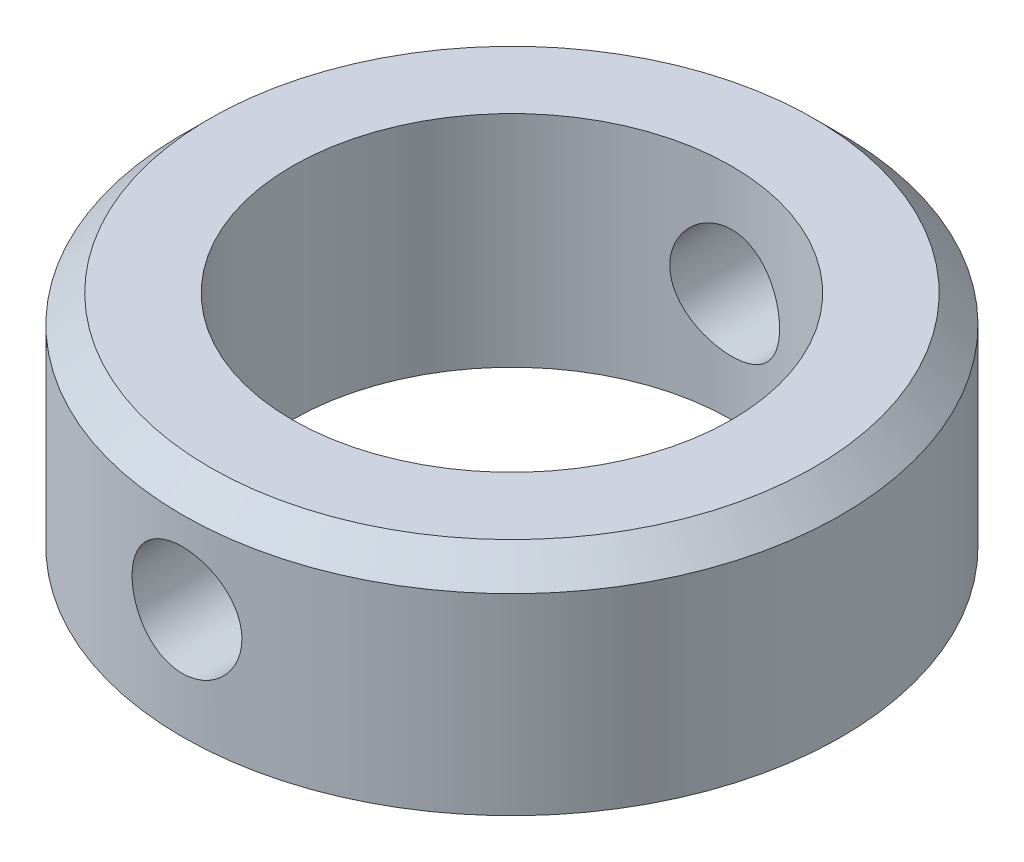
ISO-10303-21;
HEADER;
FILE_DESCRIPTION(('STEP AP214'),'2;1');
FILE_NAME('part.step','',(''),(''),'','','');
FILE_SCHEMA(('AUTOMOTIVE_DESIGN { 1 0 10303 214 1 1 1 1 }'));
ENDSEC;
DATA;
#1=APPLICATION_CONTEXT('core data for automotive mechanical design processes');
#2=APPLICATION_PROTOCOL_DEFINITION('international standard','automotive_design',2000,#1);
#3=PRODUCT_CONTEXT('',#1,'mechanical');
#4=PRODUCT('Part','Part','',(#3));
#5=PRODUCT_RELATED_PRODUCT_CATEGORY('part','',(#4));
#6=PRODUCT_DEFINITION_FORMATION('','',#4);
#7=PRODUCT_DEFINITION_CONTEXT('part definition',#1,'design');
#8=PRODUCT_DEFINITION('design','',#6,#7);
#9=PRODUCT_DEFINITION_SHAPE('','',#8);
#10=(LENGTH_UNIT() NAMED_UNIT(*) SI_UNIT(.MILLI.,.METRE.));
#11=(NAMED_UNIT(*) PLANE_ANGLE_UNIT() SI_UNIT($,.RADIAN.));
#12=(NAMED_UNIT(*) SI_UNIT($,.STERADIAN.) SOLID_ANGLE_UNIT());
#13=UNCERTAINTY_MEASURE_WITH_UNIT(LENGTH_MEASURE(1.E-05),#10,'distance_accuracy_value','');
#14=(GEOMETRIC_REPRESENTATION_CONTEXT(3) GLOBAL_UNCERTAINTY_ASSIGNED_CONTEXT((#13)) GLOBAL_UNIT_ASSIGNED_CONTEXT((#10,
#11,#12)) REPRESENTATION_CONTEXT('',''));
#15=CARTESIAN_POINT('',(0.,0.,0.));
#16=DIRECTION('',(0.,0.,1.));
#17=DIRECTION('',(1.,0.,0.));
#18=AXIS2_PLACEMENT_3D('',#15,#16,#17);
#19=CARTESIAN_POINT('',(0.,8.,0.));
#20=DIRECTION('',(0.,1.,0.));
#21=DIRECTION('',(0.,0.,1.));
#22=AXIS2_PLACEMENT_3D('',#19,#20,#21);
#23=PLANE('',#22);
#24=CARTESIAN_POINT('',(0.,8.,0.));
#25=DIRECTION('',(0.,1.,0.));
#26=DIRECTION('',(0.,0.,1.));
#27=AXIS2_PLACEMENT_3D('',#24,#25,#26);
#28=CIRCLE('',#27,11.);
#29=CARTESIAN_POINT('',(0.,8.,11.));
#30=VERTEX_POINT('',#29);
#31=EDGE_CURVE('E48',#30,#30,#28,.T.);
#32=ORIENTED_EDGE('',*,*,#31,.T.);
#33=EDGE_LOOP('',(#32));
#34=FACE_BOUND('',#33,.T.);
#35=CARTESIAN_POINT('',(0.,8.,0.));
#36=DIRECTION('',(0.,1.,0.));
#37=DIRECTION('',(0.,0.,1.));
#38=AXIS2_PLACEMENT_3D('',#35,#36,#37);
#39=CIRCLE('',#38,8.);
#40=CARTESIAN_POINT('',(0.,8.,8.));
#41=VERTEX_POINT('',#40);
#42=EDGE_CURVE('E58',#41,#41,#39,.T.);
#43=ORIENTED_EDGE('',*,*,#42,.F.);
#44=EDGE_LOOP('',(#43));
#45=FACE_BOUND('',#44,.T.);
#46=ADVANCED_FACE('F39',(#34,#45),#23,.T.);
#47=CARTESIAN_POINT('',(0.,0.,0.));
#48=DIRECTION('',(0.,1.,0.));
#49=DIRECTION('',(0.,0.,1.));
#50=AXIS2_PLACEMENT_3D('',#47,#48,#49);
#51=PLANE('',#50);
#52=CARTESIAN_POINT('',(0.,0.,0.));
#53=DIRECTION('',(0.,1.,0.));
#54=DIRECTION('',(0.,0.,1.));
#55=AXIS2_PLACEMENT_3D('',#52,#53,#54);
#56=CIRCLE('',#55,12.);
#57=CARTESIAN_POINT('',(0.,0.,12.));
#58=VERTEX_POINT('',#57);
#59=EDGE_CURVE('E53',#58,#58,#56,.T.);
#60=ORIENTED_EDGE('',*,*,#59,.F.);
#61=EDGE_LOOP('',(#60));
#62=FACE_BOUND('',#61,.T.);
#63=CARTESIAN_POINT('',(0.,0.,0.));
#64=DIRECTION('',(0.,1.,0.));
#65=DIRECTION('',(0.,0.,1.));
#66=AXIS2_PLACEMENT_3D('',#63,#64,#65);
#67=CIRCLE('',#66,8.);
#68=CARTESIAN_POINT('',(0.,0.,8.));
#69=VERTEX_POINT('',#68);
#70=EDGE_CURVE('E114',#69,#69,#67,.T.);
#71=ORIENTED_EDGE('',*,*,#70,.T.);
#72=EDGE_LOOP('',(#71));
#73=FACE_BOUND('',#72,.T.);
#74=ADVANCED_FACE('F102',(#62,#73),#51,.F.);
#75=CARTESIAN_POINT('',(0.,8.,0.));
#76=DIRECTION('',(0.,-1.,0.));
#77=DIRECTION('',(0.,0.,-1.));
#78=AXIS2_PLACEMENT_3D('',#75,#76,#77);
#79=CYLINDRICAL_SURFACE('',#78,12.);
#80=CARTESIAN_POINT('',(0.,6.99999999999999,0.));
#81=DIRECTION('',(0.,1.,0.));
#82=DIRECTION('',(0.,0.,1.));
#83=AXIS2_PLACEMENT_3D('',#80,#81,#82);
#84=CIRCLE('',#83,12.);
#85=CARTESIAN_POINT('',(0.,6.99999999999999,12.));
#86=VERTEX_POINT('',#85);
#87=EDGE_CURVE('E10',#86,#86,#84,.F.);
#88=ORIENTED_EDGE('',*,*,#87,.T.);
#89=EDGE_LOOP('',(#88));
#90=FACE_BOUND('',#89,.T.);
#91=CARTESIAN_POINT('',(0.,6.,-12.));
#92=CARTESIAN_POINT('',(-0.111512723966572,5.99999552884175,-11.9999980893506));
#93=CARTESIAN_POINT('',(-0.223086305471057,5.99064218002486,-11.9984294233043));
#94=CARTESIAN_POINT('',(-0.443104177338434,5.95349147298774,-11.9923227595311));
#95=CARTESIAN_POINT('',(-0.551545494367397,5.92567715447072,-11.9877820313911));
#96=CARTESIAN_POINT('',(-0.762083797770115,5.8524676411258,-11.9762405458916));
#97=CARTESIAN_POINT('',(-0.86418589474552,5.80708682748754,-11.9692418012735));
#98=CARTESIAN_POINT('',(-1.05931347358235,5.70007016635808,-11.9535538166566));
#99=CARTESIAN_POINT('',(-1.15233999190287,5.6384361780136,-11.9448647700355));
#100=CARTESIAN_POINT('',(-1.32757809143334,5.50003593294363,-11.9266665396665));
#101=CARTESIAN_POINT('',(-1.40969032282797,5.4231447082911,-11.9171509745189));
#102=CARTESIAN_POINT('',(-1.55991079892794,5.25668162522175,-11.8984210150139));
#103=CARTESIAN_POINT('',(-1.62801815951278,5.16710896683471,-11.8892066397013));
#104=CARTESIAN_POINT('',(-1.74869370048411,4.97714322704236,-11.8720605260782));
#105=CARTESIAN_POINT('',(-1.8011636422888,4.8766869305562,-11.8641370327331));
#106=CARTESIAN_POINT('',(-1.88844669232898,4.6682323485595,-11.8505583183574));
#107=CARTESIAN_POINT('',(-1.92326099325249,4.56023457305789,-11.8449029441145));
#108=CARTESIAN_POINT('',(-1.97393150222785,4.34081578011477,-11.836564294742));
#109=CARTESIAN_POINT('',(-1.98995922330832,4.22943541079889,-11.8338541478856));
#110=CARTESIAN_POINT('',(-2.0031333802319,4.00553577849322,-11.8316315114932));
#111=CARTESIAN_POINT('',(-2.0002811523112,3.89301659666616,-11.8321187956577));
#112=CARTESIAN_POINT('',(-1.97591607871692,3.67125771097964,-11.8362114309084));
#113=CARTESIAN_POINT('',(-1.95459590551182,3.56199615716381,-11.8397845865513));
#114=CARTESIAN_POINT('',(-1.89420251232276,3.34862294573669,-11.8495959616881));
#115=CARTESIAN_POINT('',(-1.85512868345579,3.24451146488916,-11.8558342725862));
#116=CARTESIAN_POINT('',(-1.76014179687513,3.04381694124727,-11.8703078346728));
#117=CARTESIAN_POINT('',(-1.70414873110377,2.94727247513502,-11.8785525368586));
#118=CARTESIAN_POINT('',(-1.57696961404595,2.76487647956929,-11.8961033473201));
#119=CARTESIAN_POINT('',(-1.50578233652343,2.67902581403606,-11.9054095412343));
#120=CARTESIAN_POINT('',(-1.34918576972724,2.51933913135412,-11.9241762230383));
#121=CARTESIAN_POINT('',(-1.2636111710985,2.44566518516794,-11.9336371938532));
#122=CARTESIAN_POINT('',(-1.08122819918532,2.31369778986773,-11.9515408111738));
#123=CARTESIAN_POINT('',(-0.984419753525138,2.25540443985342,-11.959983451118));
#124=CARTESIAN_POINT('',(-0.782164732933369,2.15583821829097,-11.9749111431433));
#125=CARTESIAN_POINT('',(-0.676710980451729,2.114579664535,-11.9813945472596));
#126=CARTESIAN_POINT('',(-0.460238676482185,2.05040462780322,-11.9916600241013));
#127=CARTESIAN_POINT('',(-0.349220591343575,2.02748661042103,-11.9954423228038));
#128=CARTESIAN_POINT('',(-0.1261679210413,2.00086291323109,-11.9998490387415));
#129=CARTESIAN_POINT('',(-0.0141605897208097,1.99693474255551,-12.0005100241023));
#130=CARTESIAN_POINT('',(0.208911818311909,2.0078090755425,-11.9986997953694));
#131=CARTESIAN_POINT('',(0.31997693111363,2.02261085850699,-11.9962287017929));
#132=CARTESIAN_POINT('',(0.53732494043741,2.07033987946838,-11.9884546155056));
#133=CARTESIAN_POINT('',(0.643632694708302,2.1031569667121,-11.9831688384105));
#134=CARTESIAN_POINT('',(0.849237507888353,2.18586761455963,-11.9703557156429));
#135=CARTESIAN_POINT('',(0.948534172727774,2.23576213410822,-11.9628282440962));
#136=CARTESIAN_POINT('',(1.13826455157517,2.35172089975743,-11.9462761304193));
#137=CARTESIAN_POINT('',(1.22861220074972,2.4179241249338,-11.9372388470962));
#138=CARTESIAN_POINT('',(1.39699486840215,2.56442985230805,-11.9187077391352));
#139=CARTESIAN_POINT('',(1.47502899175727,2.64473337862133,-11.9092138813724));
#140=CARTESIAN_POINT('',(1.6173942237264,2.81815803845714,-11.8907214018868));
#141=CARTESIAN_POINT('',(1.68157500889097,2.91140333241153,-11.8817289290968));
#142=CARTESIAN_POINT('',(1.79336184823599,3.10748237531083,-11.8653722382231));
#143=CARTESIAN_POINT('',(1.84096842781586,3.210315820182,-11.8580079685282));
#144=CARTESIAN_POINT('',(1.91803066517852,3.42223178624971,-11.8457876295816));
#145=CARTESIAN_POINT('',(1.94756114603836,3.53128647602439,-11.8409212344885));
#146=CARTESIAN_POINT('',(1.98786836302262,3.75289610337741,-11.8342217346821));
#147=CARTESIAN_POINT('',(1.99864672955693,3.86545073578564,-11.8323883662618));
#148=CARTESIAN_POINT('',(2.00109829283788,4.08936413276993,-11.8319738646721));
#149=CARTESIAN_POINT('',(1.99300810890015,4.20072030286023,-11.8333524520452));
#150=CARTESIAN_POINT('',(1.95846387116548,4.42046339844061,-11.8391182516298));
#151=CARTESIAN_POINT('',(1.93200987688998,4.5288503335535,-11.8435054540897));
#152=CARTESIAN_POINT('',(1.86157959167592,4.73948674983409,-11.8547788502538));
#153=CARTESIAN_POINT('',(1.81762367248035,4.84174320804482,-11.8616621377574));
#154=CARTESIAN_POINT('',(1.71346160313273,5.03746853535588,-11.8771549513777));
#155=CARTESIAN_POINT('',(1.65325464699885,5.13093696829771,-11.8857645631072));
#156=CARTESIAN_POINT('',(1.51745510749772,5.3076284664862,-11.903867632365));
#157=CARTESIAN_POINT('',(1.44168845087492,5.39071681336022,-11.9133703646104));
#158=CARTESIAN_POINT('',(1.27728722510418,5.54308128357995,-11.9321149788867));
#159=CARTESIAN_POINT('',(1.18864969033011,5.61235421491054,-11.9413568002124));
#160=CARTESIAN_POINT('',(1.00029533571223,5.73555861455996,-11.9586122371378));
#161=CARTESIAN_POINT('',(0.900506230026255,5.78938083145036,-11.9666169300248));
#162=CARTESIAN_POINT('',(0.693210455503186,5.87941558768794,-11.9804093408142));
#163=CARTESIAN_POINT('',(0.585711595864009,5.91564566486376,-11.9861992654199));
#164=CARTESIAN_POINT('',(0.398162648036322,5.96160421930133,-11.9936463266636));
#165=CARTESIAN_POINT('',(0.319247064238759,5.97597957569277,-11.9960162181869));
#166=CARTESIAN_POINT('',(0.160231448255848,5.9951789902758,-11.999193727889));
#167=CARTESIAN_POINT('',(0.0801314364867958,6.00000321290989,-12.0000013729651));
#168=CARTESIAN_POINT('',(0.,6.,-12.));
#169=B_SPLINE_CURVE_WITH_KNOTS('',3,(#91,#92,#93,#94,#95,#96,#97,#98,#99,#100,#101,#102,#103,
#104,#105,#106,#107,#108,#109,#110,#111,#112,#113,#114,#115,#116,#117,#118,#119,#120,#121,#122,
#123,#124,#125,#126,#127,#128,#129,#130,#131,#132,#133,#134,#135,#136,#137,#138,#139,#140,#141,
#142,#143,#144,#145,#146,#147,#148,#149,#150,#151,#152,#153,#154,#155,#156,#157,#158,#159,#160,
#161,#162,#163,#164,#165,#166,#167,#168),.UNSPECIFIED.,.T.,.F.,(4,2,2,2,2,2,2,2,2,2,2,2,2,2,2,2,
2,2,2,2,2,2,2,2,2,2,2,2,2,2,2,2,2,2,2,2,2,2,4),(0.,0.334245267950808,0.668798036556336,
1.00307749362022,1.33731873013983,1.67441992849866,2.01154240135885,2.35074016659072,
2.68991501500945,3.02596861682739,3.36199843456709,3.69456417408327,4.02714132020305,
4.36131645306046,4.69551856544459,5.03386215929061,5.37220793308678,5.71083751132723,
6.04943875616919,6.38406306793118,6.71867450428688,7.05126245605132,7.38386908660853,
7.71941460501619,8.05498450443426,8.39403057606095,8.73306589900754,9.07068817873418,
9.40828110229294,9.7416632761816,10.0750443695051,10.4080385458098,10.7410492402347,
11.0780110735471,11.4150506710318,11.7544178528576,12.0934460170406,12.3336339853121,
12.5738178182157),.UNSPECIFIED.);
#170=CARTESIAN_POINT('',(0.,6.,-12.));
#171=VERTEX_POINT('',#170);
#172=EDGE_CURVE('E93',#171,#171,#169,.T.);
#173=ORIENTED_EDGE('',*,*,#172,.T.);
#174=EDGE_LOOP('',(#173));
#175=FACE_BOUND('',#174,.T.);
#176=CARTESIAN_POINT('',(2.,4.,11.8321595661992));
#177=CARTESIAN_POINT('',(1.99999551873586,3.88849940147055,11.8321615789328));
#178=CARTESIAN_POINT('',(1.99064413522263,3.77693791514282,11.8337527390819));
#179=CARTESIAN_POINT('',(1.9535019424531,3.55694516538947,11.8399396576003));
#180=CARTESIAN_POINT('',(1.92569412824689,3.44851688499355,11.844538186771));
#181=CARTESIAN_POINT('',(1.8525036349364,3.23800617332672,11.8562048749385));
#182=CARTESIAN_POINT('',(1.80713564394559,3.1359185210702,11.8632709694721));
#183=CARTESIAN_POINT('',(1.70014919751157,2.94081523622578,11.8790741768183));
#184=CARTESIAN_POINT('',(1.63853257080106,2.84779858433814,11.8878111015538));
#185=CARTESIAN_POINT('',(1.50015002157323,2.67254972020435,11.906067769247));
#186=CARTESIAN_POINT('',(1.42325523914587,2.59041989489103,11.9155937386236));
#187=CARTESIAN_POINT('',(1.25677760375622,2.44016535451055,11.9342998453486));
#188=CARTESIAN_POINT('',(1.16719399931998,2.37204146950767,11.9434799621739));
#189=CARTESIAN_POINT('',(0.977218295958686,2.25134834622458,11.9605258958617));
#190=CARTESIAN_POINT('',(0.876764865165368,2.19887439381456,11.9683835394587));
#191=CARTESIAN_POINT('',(0.668316497379095,2.11158314357556,11.9818298956567));
#192=CARTESIAN_POINT('',(0.560322051262551,2.0767646976921,11.9874187557813));
#193=CARTESIAN_POINT('',(0.340914981075394,2.02608597201288,11.9956538777952));
#194=CARTESIAN_POINT('',(0.229543109343417,2.01005366719625,11.9983268248873));
#195=CARTESIAN_POINT('',(0.00566022842063799,1.99686739667792,12.0005206347422));
#196=CARTESIAN_POINT('',(-0.106850702823118,1.99971214780221,12.0000417117545));
#197=CARTESIAN_POINT('',(-0.3286417480631,2.02406508122257,11.9960068674511));
#198=CARTESIAN_POINT('',(-0.437942824560112,2.04538813072732,11.9924814695392));
#199=CARTESIAN_POINT('',(-0.651393583689433,2.10580085939719,11.9827838301731));
#200=CARTESIAN_POINT('',(-0.755543109321203,2.1448910796716,11.9766115081057));
#201=CARTESIAN_POINT('',(-0.956284918226118,2.23991251225226,11.9622615880957));
#202=CARTESIAN_POINT('',(-1.05284041841524,2.29592000966595,11.954074938615));
#203=CARTESIAN_POINT('',(-1.23525242387731,2.42313025810804,11.936605904572));
#204=CARTESIAN_POINT('',(-1.3211080623327,2.49433423896865,11.9273234313531));
#205=CARTESIAN_POINT('',(-1.48077701875733,2.65094304529545,11.9085621458608));
#206=CARTESIAN_POINT('',(-1.55443160180257,2.73650967592079,11.8990823178483));
#207=CARTESIAN_POINT('',(-1.68636367075845,2.91886967217266,11.8811036782784));
#208=CARTESIAN_POINT('',(-1.74464101482593,3.01566314134626,11.8726048757706));
#209=CARTESIAN_POINT('',(-1.84419554759063,3.21791331350198,11.8575500364945));
#210=CARTESIAN_POINT('',(-1.88545362182339,3.32337959847367,11.8509961864208));
#211=CARTESIAN_POINT('',(-1.94962389665249,3.53987925784604,11.840609509519));
#212=CARTESIAN_POINT('',(-1.97253771261436,3.65091214114594,11.8367764431066));
#213=CARTESIAN_POINT('',(-1.99914550790341,3.87397292492971,11.8323116753769));
#214=CARTESIAN_POINT('',(-2.00306576632995,3.98597310376168,11.8316422860694));
#215=CARTESIAN_POINT('',(-1.99217816214597,4.20902933735266,11.8334802782589));
#216=CARTESIAN_POINT('',(-1.97737102289973,4.32008542841118,11.8359875370548));
#217=CARTESIAN_POINT('',(-1.92964186794248,4.53738220735269,11.8438614996401));
#218=CARTESIAN_POINT('',(-1.89683503251711,4.64364891190241,11.8492100153468));
#219=CARTESIAN_POINT('',(-1.81415855215382,4.84917613302359,11.862148584044));
#220=CARTESIAN_POINT('',(-1.76428788648075,4.94843623004072,11.8697387711246));
#221=CARTESIAN_POINT('',(-1.64836533858338,5.13813967552489,11.8863930271791));
#222=CARTESIAN_POINT('',(-1.58216845132749,5.22849325820485,11.8954700448028));
#223=CARTESIAN_POINT('',(-1.43567157256639,5.396890826156,11.9140373334389));
#224=CARTESIAN_POINT('',(-1.35537058910724,5.47493394488779,11.9235276334827));
#225=CARTESIAN_POINT('',(-1.18194245626305,5.61732151418296,11.9419713769461));
#226=CARTESIAN_POINT('',(-1.08869060270896,5.68151506102763,11.9509182107574));
#227=CARTESIAN_POINT('',(-0.892594758359461,5.7933242616039,11.9671608994635));
#228=CARTESIAN_POINT('',(-0.789751077976501,5.84094045157908,11.9744568077598));
#229=CARTESIAN_POINT('',(-0.577839241201063,5.91800846716389,11.9865468653567));
#230=CARTESIAN_POINT('',(-0.468800450082089,5.94753926058794,11.9913518765409));
#231=CARTESIAN_POINT('',(-0.247224587899369,5.98785247917106,11.9979646653543));
#232=CARTESIAN_POINT('',(-0.134687805457296,5.99863644698588,11.9997726896015));
#233=CARTESIAN_POINT('',(0.0892330206189413,6.00110550584976,12.0001843031025));
#234=CARTESIAN_POINT('',(0.200614528482132,5.99302020315287,11.9988264161935));
#235=CARTESIAN_POINT('',(0.420409579451764,5.95847686218446,11.9931374270987));
#236=CARTESIAN_POINT('',(0.528823139173983,5.93201892679226,11.9888063415615));
#237=CARTESIAN_POINT('',(0.739517156734831,5.86156946756508,11.9776559106192));
#238=CARTESIAN_POINT('',(0.841804297723057,5.81759746543196,11.970839336327));
#239=CARTESIAN_POINT('',(1.03758436238573,5.71339365101553,11.9554620550242));
#240=CARTESIAN_POINT('',(1.13107686889458,5.65316106795004,11.9469012653393));
#241=CARTESIAN_POINT('',(1.30777035642112,5.5173319260316,11.9288610369313));
#242=CARTESIAN_POINT('',(1.3908411444822,5.44156723619899,11.919372196329));
#243=CARTESIAN_POINT('',(1.54317110076073,5.27717735367695,11.900610426515));
#244=CARTESIAN_POINT('',(1.61242702936952,5.18854915286997,11.8913375483961));
#245=CARTESIAN_POINT('',(1.73561141672869,5.00020374200831,11.8739867482713));
#246=CARTESIAN_POINT('',(1.78942799124616,4.90041252818761,11.8659177427663));
#247=CARTESIAN_POINT('',(1.87945162912342,4.69311261132948,11.8519936807305));
#248=CARTESIAN_POINT('',(1.91567628417846,4.58561174185811,11.846136413799));
#249=CARTESIAN_POINT('',(1.96162084250194,4.39807698441009,11.8385979588519));
#250=CARTESIAN_POINT('',(1.97598993413711,4.31917855362991,11.8361969873557));
#251=CARTESIAN_POINT('',(1.99518103614505,4.16019721213045,11.8329770823046));
#252=CARTESIAN_POINT('',(2.00000321983422,4.08011432294064,11.8321581200295));
#253=CARTESIAN_POINT('',(2.,4.,11.8321595661992));
#254=B_SPLINE_CURVE_WITH_KNOTS('',3,(#176,#177,#178,#179,#180,#181,#182,#183,#184,#185,#186,
#187,#188,#189,#190,#191,#192,#193,#194,#195,#196,#197,#198,#199,#200,#201,#202,#203,#204,#205,
#206,#207,#208,#209,#210,#211,#212,#213,#214,#215,#216,#217,#218,#219,#220,#221,#222,#223,#224,
#225,#226,#227,#228,#229,#230,#231,#232,#233,#234,#235,#236,#237,#238,#239,#240,#241,#242,#243,
#244,#245,#246,#247,#248,#249,#250,#251,#252,#253),.UNSPECIFIED.,.T.,.F.,(4,2,2,2,2,2,2,2,2,2,2,
2,2,2,2,2,2,2,2,2,2,2,2,2,2,2,2,2,2,2,2,2,2,2,2,2,2,2,4),(0.,0.334208831142192,
0.668726015970375,1.00296399830015,1.33716437924219,1.67431327324572,2.01148214267558,
2.35066384089148,2.6898234808889,3.02585253978052,3.36185875722153,3.69453696931735,
4.02722531399626,4.3614368331154,4.69567540981411,5.03396898769699,5.37226568596815,
5.71094129998883,6.04958708750462,6.38418833936328,6.71877666731181,7.05124851708393,
7.38374025834859,7.71929874210161,8.05488083544551,8.39395290428305,8.73301400381358,
9.07058387534117,9.4081259672988,9.74158221012733,10.0750365857506,10.4081203186597,
10.7412198431387,11.078135979706,11.4151310310545,11.7545098209466,12.0935485339556,
12.3336853643501,12.5738178352145),.UNSPECIFIED.);
#255=CARTESIAN_POINT('',(2.,4.,11.8321595661992));
#256=VERTEX_POINT('',#255);
#257=EDGE_CURVE('E70',#256,#256,#254,.T.);
#258=ORIENTED_EDGE('',*,*,#257,.T.);
#259=EDGE_LOOP('',(#258));
#260=FACE_BOUND('',#259,.T.);
#261=ORIENTED_EDGE('',*,*,#59,.T.);
#262=EDGE_LOOP('',(#261));
#263=FACE_BOUND('',#262,.T.);
#264=ADVANCED_FACE('F98',(#90,#175,#260,#263),#79,.T.);
#265=CARTESIAN_POINT('',(0.,8.,0.));
#266=DIRECTION('',(0.,-1.,0.));
#267=DIRECTION('',(0.,0.,-1.));
#268=AXIS2_PLACEMENT_3D('',#265,#266,#267);
#269=CYLINDRICAL_SURFACE('',#268,8.);
#270=CARTESIAN_POINT('',(0.,6.,-8.));
#271=CARTESIAN_POINT('',(-0.110501451559641,5.99999689901579,-7.9999981315735));
#272=CARTESIAN_POINT('',(-0.221037543774351,5.99081126563495,-7.99768770842435));
#273=CARTESIAN_POINT('',(-0.438941765027377,5.95436646492399,-7.98869485106526));
#274=CARTESIAN_POINT('',(-0.546308062494319,5.92709705394953,-7.98200993893301));
#275=CARTESIAN_POINT('',(-0.754694496243435,5.85541432871722,-7.96500835109376));
#276=CARTESIAN_POINT('',(-0.855722084573335,5.81102160171297,-7.95469603789411));
#277=CARTESIAN_POINT('',(-1.04889617587257,5.70642481327354,-7.93153791743495));
#278=CARTESIAN_POINT('',(-1.14104237913168,5.64622021850804,-7.91869202472209));
#279=CARTESIAN_POINT('',(-1.31573590306789,5.51039894712776,-7.89156551455591));
#280=CARTESIAN_POINT('',(-1.39807425341474,5.43451790005459,-7.87726276197502));
#281=CARTESIAN_POINT('',(-1.54899856960442,5.27006372678795,-7.84898160157248));
#282=CARTESIAN_POINT('',(-1.61758298259892,5.18148916940409,-7.83500323053157));
#283=CARTESIAN_POINT('',(-1.74003539039863,4.99253969768401,-7.80873034264225));
#284=CARTESIAN_POINT('',(-1.79366962123352,4.89200902558836,-7.79646392619748));
#285=CARTESIAN_POINT('',(-1.88319587806766,4.68300211778662,-7.77532659757355));
#286=CARTESIAN_POINT('',(-1.91909074058685,4.57452715555731,-7.76645514259224));
#287=CARTESIAN_POINT('',(-1.97140644907302,4.35500866906445,-7.7533396892843));
#288=CARTESIAN_POINT('',(-1.98820302444274,4.24406013861601,-7.74900654662681));
#289=CARTESIAN_POINT('',(-2.00301570008854,4.02084190800087,-7.74519149946122));
#290=CARTESIAN_POINT('',(-2.00103485575748,3.90857242574382,-7.74570880570571));
#291=CARTESIAN_POINT('',(-1.97864869951961,3.6887789230062,-7.75145607355756));
#292=CARTESIAN_POINT('',(-1.95869112025418,3.58120583804623,-7.75657150676391));
#293=CARTESIAN_POINT('',(-1.90163224920399,3.37098526545192,-7.77075612894758));
#294=CARTESIAN_POINT('',(-1.86452973609252,3.26833812929477,-7.77982559958985));
#295=CARTESIAN_POINT('',(-1.77385263724958,3.06968264499716,-7.80100151874212));
#296=CARTESIAN_POINT('',(-1.72011555631056,2.97375177094724,-7.81313769959755));
#297=CARTESIAN_POINT('',(-1.59780836801993,2.79210838699091,-7.83906281127988));
#298=CARTESIAN_POINT('',(-1.52923566507845,2.70639766924367,-7.85285203112837));
#299=CARTESIAN_POINT('',(-1.37688456624163,2.54506184574079,-7.88101174053188));
#300=CARTESIAN_POINT('',(-1.29272834422115,2.46979401325153,-7.89538759304001));
#301=CARTESIAN_POINT('',(-1.11281589000493,2.3343716767148,-7.92274620771675));
#302=CARTESIAN_POINT('',(-1.01705930361059,2.27421763431525,-7.93572892732543));
#303=CARTESIAN_POINT('',(-0.816154518241856,2.17059921836749,-7.9589030945892));
#304=CARTESIAN_POINT('',(-0.710975190944831,2.12719287966076,-7.96908480170303));
#305=CARTESIAN_POINT('',(-0.494501344190511,2.05877692572057,-7.98543889321888));
#306=CARTESIAN_POINT('',(-0.383207998867313,2.03376379144248,-7.99161204452374));
#307=CARTESIAN_POINT('',(-0.160719960520036,2.00338991258822,-7.999139990285));
#308=CARTESIAN_POINT('',(-0.0495956266509469,1.9975426318996,-8.00061404677705));
#309=CARTESIAN_POINT('',(0.172043833068677,2.00433200274065,-7.99891739752601));
#310=CARTESIAN_POINT('',(0.282559012859459,2.01696699039884,-7.99574710989128));
#311=CARTESIAN_POINT('',(0.498152358368655,2.05996121118851,-7.98519441503143));
#312=CARTESIAN_POINT('',(0.603286825291672,2.09005501796932,-7.97787512247748));
#313=CARTESIAN_POINT('',(0.807009723270015,2.16680944537126,-7.95984942178845));
#314=CARTESIAN_POINT('',(0.905597492043512,2.21347173908423,-7.94914267159856));
#315=CARTESIAN_POINT('',(1.0953641792398,2.3229815051663,-7.92524410568414));
#316=CARTESIAN_POINT('',(1.18638058911444,2.38610148319568,-7.91201156489243));
#317=CARTESIAN_POINT('',(1.35670215152433,2.52638654506263,-7.88459345583226));
#318=CARTESIAN_POINT('',(1.43600527863068,2.60355405282254,-7.87040772335606));
#319=CARTESIAN_POINT('',(1.58265409076364,2.77200261445929,-7.84225275947695));
#320=CARTESIAN_POINT('',(1.64965849016271,2.86358360400323,-7.82829738916375));
#321=CARTESIAN_POINT('',(1.7673476786836,3.05697684595429,-7.80257171169652));
#322=CARTESIAN_POINT('',(1.81803319221058,3.15878864394634,-7.79080130756035));
#323=CARTESIAN_POINT('',(1.90126856081239,3.3692076298841,-7.77090792979554));
#324=CARTESIAN_POINT('',(1.93392586220542,3.47777017112535,-7.76276340389208));
#325=CARTESIAN_POINT('',(1.98046087993837,3.69907951718548,-7.75102325453578));
#326=CARTESIAN_POINT('',(1.99434270330488,3.81182540137665,-7.74742663626581));
#327=CARTESIAN_POINT('',(2.00271812044533,4.03482803180694,-7.74526534938609));
#328=CARTESIAN_POINT('',(1.99775719704016,4.14506324683297,-7.74655910304351));
#329=CARTESIAN_POINT('',(1.96983637108382,4.36307185155731,-7.7537054534379));
#330=CARTESIAN_POINT('',(1.94687683024903,4.47084529068487,-7.75955795855809));
#331=CARTESIAN_POINT('',(1.88390842592373,4.68027794542054,-7.77508347576963));
#332=CARTESIAN_POINT('',(1.84400187290717,4.78196974032028,-7.78473353648412));
#333=CARTESIAN_POINT('',(1.74835321814009,4.97728717695158,-7.80677007633105));
#334=CARTESIAN_POINT('',(1.69260892004558,5.07091169758255,-7.81915693494364));
#335=CARTESIAN_POINT('',(1.56515699818285,5.25007283866936,-7.84567512351349));
#336=CARTESIAN_POINT('',(1.49307088388301,5.33533476456528,-7.85984353109009));
#337=CARTESIAN_POINT('',(1.33571916158631,5.49272939306054,-7.88810702995048));
#338=CARTESIAN_POINT('',(1.25045042834819,5.56485897348396,-7.90220210302746));
#339=CARTESIAN_POINT('',(1.06729011560345,5.69521507808614,-7.92903540863551));
#340=CARTESIAN_POINT('',(0.96919789642185,5.7531661515621,-7.94174444487824));
#341=CARTESIAN_POINT('',(0.764354746013969,5.85166328392071,-7.96406566633491));
#342=CARTESIAN_POINT('',(0.65761008458232,5.89222181419805,-7.97368006933042));
#343=CARTESIAN_POINT('',(0.459213670991296,5.94876244043954,-7.98730746087389));
#344=CARTESIAN_POINT('',(0.368506894544091,5.96793499073791,-7.9920344673692));
#345=CARTESIAN_POINT('',(0.185208095381711,5.99355459149592,-7.99838140309264));
#346=CARTESIAN_POINT('',(0.0926162149901548,6.00000259907373,-8.00000156601192));
#347=CARTESIAN_POINT('',(0.,6.,-8.));
#348=B_SPLINE_CURVE_WITH_KNOTS('',3,(#270,#271,#272,#273,#274,#275,#276,#277,#278,#279,#280,
#281,#282,#283,#284,#285,#286,#287,#288,#289,#290,#291,#292,#293,#294,#295,#296,#297,#298,#299,
#300,#301,#302,#303,#304,#305,#306,#307,#308,#309,#310,#311,#312,#313,#314,#315,#316,#317,#318,
#319,#320,#321,#322,#323,#324,#325,#326,#327,#328,#329,#330,#331,#332,#333,#334,#335,#336,#337,
#338,#339,#340,#341,#342,#343,#344,#345,#346,#347),.UNSPECIFIED.,.T.,.F.,(4,2,2,2,2,2,2,2,2,2,2,
2,2,2,2,2,2,2,2,2,2,2,2,2,2,2,2,2,2,2,2,2,2,2,2,2,2,2,4),(0.,0.331164949962519,
0.662517650351866,0.99347320304814,1.32443992022577,1.66152580582852,1.99864972773416,
2.34078196727742,2.68285948225824,3.01808393468093,3.3532538415469,3.68029996013785,
4.00736937959145,4.337740371696,4.66816921119311,5.00802001296453,5.34788119415424,
5.6889097201658,6.02987298255951,6.36211078603462,6.69431868154751,7.02160366023144,
7.34892169767481,7.68204783424897,8.01523150681786,8.35659345610395,8.69794025003772,
9.03723006156476,9.37644564340971,9.70591707202577,10.0353818794581,10.3628853408369,
10.6904342418696,11.0265276855097,11.3627009303165,11.7049624733721,12.0469781843289,
12.3245632392729,12.6021274139515),.UNSPECIFIED.);
#349=CARTESIAN_POINT('',(0.,6.,-8.));
#350=VERTEX_POINT('',#349);
#351=EDGE_CURVE('E61',#350,#350,#348,.T.);
#352=ORIENTED_EDGE('',*,*,#351,.F.);
#353=EDGE_LOOP('',(#352));
#354=FACE_BOUND('',#353,.T.);
#355=CARTESIAN_POINT('',(2.,4.,7.74596669241483));
#356=CARTESIAN_POINT('',(1.99999686287446,3.88955939925874,7.74596880070288));
#357=CARTESIAN_POINT('',(1.99082099639812,3.77908408105718,7.74835444811678));
#358=CARTESIAN_POINT('',(1.95441850037103,3.56130593746119,7.75761489594051));
#359=CARTESIAN_POINT('',(1.92718136539368,3.45400499642545,7.76449230897304));
#360=CARTESIAN_POINT('',(1.85559295970563,3.24575716945026,7.7819097967692));
#361=CARTESIAN_POINT('',(1.81126378228359,3.14480227569143,7.79244514152366));
#362=CARTESIAN_POINT('',(1.70681691300911,2.9517513179681,7.81598553623007));
#363=CARTESIAN_POINT('',(1.64669855084855,2.85965563033583,7.82899069102791));
#364=CARTESIAN_POINT('',(1.51096674184951,2.68491068379023,7.856325730845));
#365=CARTESIAN_POINT('',(1.43506951016324,2.60248511971996,7.87067678098427));
#366=CARTESIAN_POINT('',(1.27054565128053,2.45139088451173,7.89890300412235));
#367=CARTESIAN_POINT('',(1.18191783534425,2.3827234995026,7.91277813253111));
#368=CARTESIAN_POINT('',(0.992916160863166,2.26017962589498,7.93872332416466));
#369=CARTESIAN_POINT('',(0.892395660956098,2.20652288947083,7.95076549920474));
#370=CARTESIAN_POINT('',(0.683410547434212,2.11695228467753,7.97144649540787));
#371=CARTESIAN_POINT('',(0.574947108633554,2.08103579846759,7.98008581867475));
#372=CARTESIAN_POINT('',(0.355487007003331,2.02868173233713,7.99283807078544));
#373=CARTESIAN_POINT('',(0.244586175639182,2.01186428453873,7.99703915075451));
#374=CARTESIAN_POINT('',(0.0214630554102166,1.99699329657956,8.00074875285838));
#375=CARTESIAN_POINT('',(-0.0907590356304538,1.99893698223232,8.00025796877363));
#376=CARTESIAN_POINT('',(-0.310704494344774,2.02125988020012,7.99470475962828));
#377=CARTESIAN_POINT('',(-0.418472431202133,2.04122906004309,7.98974401872699));
#378=CARTESIAN_POINT('',(-0.629076494827372,2.0983770160388,7.97592669219883));
#379=CARTESIAN_POINT('',(-0.731912358740875,2.13555670830193,7.96706989918753));
#380=CARTESIAN_POINT('',(-0.930813407003613,2.22640205654965,7.94630007760717));
#381=CARTESIAN_POINT('',(-1.02680901953301,2.2802136357294,7.93436015756043));
#382=CARTESIAN_POINT('',(-1.20855124468098,2.40268454329301,7.90871923047719));
#383=CARTESIAN_POINT('',(-1.29429607017101,2.4713464548485,7.89501791721992));
#384=CARTESIAN_POINT('',(-1.45554807016991,2.6237669935859,7.86690971015616));
#385=CARTESIAN_POINT('',(-1.5307153581504,2.70788391387822,7.85249375620734));
#386=CARTESIAN_POINT('',(-1.66595275192604,2.8876799788322,7.82492034813365));
#387=CARTESIAN_POINT('',(-1.72602215209203,2.9833596635928,7.81176295284776));
#388=CARTESIAN_POINT('',(-1.8295762580452,3.18423202731917,7.78816397465319));
#389=CARTESIAN_POINT('',(-1.87297913394098,3.28946858425056,7.77773586980577));
#390=CARTESIAN_POINT('',(-1.94137124127268,3.50606837446116,7.76094912111966));
#391=CARTESIAN_POINT('',(-1.96636441310582,3.61743029118651,7.75458960648175));
#392=CARTESIAN_POINT('',(-1.99666371093214,3.8399676012185,7.74684284831313));
#393=CARTESIAN_POINT('',(-2.0024723791357,3.9510702346637,7.74532871274919));
#394=CARTESIAN_POINT('',(-1.99561359241244,4.17265754926253,7.74709874784831));
#395=CARTESIAN_POINT('',(-1.98294783827904,4.28314228636099,7.75038247681013));
#396=CARTESIAN_POINT('',(-1.93994037115013,4.49849141196376,7.76125665563648));
#397=CARTESIAN_POINT('',(-1.9098912546254,4.60341818125667,7.768775761875));
#398=CARTESIAN_POINT('',(-1.8332944653365,4.80674516628135,7.7872057461677));
#399=CARTESIAN_POINT('',(-1.78674483817004,4.90514460724427,7.79811702598891));
#400=CARTESIAN_POINT('',(-1.67741653434925,5.09475302229388,7.8223690967461));
#401=CARTESIAN_POINT('',(-1.6143374030685,5.18578307203448,7.83575334885313));
#402=CARTESIAN_POINT('',(-1.47412058586891,5.35615069024108,7.86333666457373));
#403=CARTESIAN_POINT('',(-1.39698058961088,5.43548633332006,7.87753586182776));
#404=CARTESIAN_POINT('',(-1.22852544196945,5.58224883405676,7.90557922425285));
#405=CARTESIAN_POINT('',(-1.13690390506319,5.64932805003905,7.91940561649468));
#406=CARTESIAN_POINT('',(-0.943405365389352,5.76714869356099,7.94477773290987));
#407=CARTESIAN_POINT('',(-0.841528897915183,5.81789097328656,7.95632357603169));
#408=CARTESIAN_POINT('',(-0.631116403462182,5.90115682762235,7.9757609259065));
#409=CARTESIAN_POINT('',(-0.522634762055766,5.93381142750325,7.98367864017925));
#410=CARTESIAN_POINT('',(-0.301499520637615,5.98036826768673,7.99508234716634));
#411=CARTESIAN_POINT('',(-0.188846730082482,5.99427412699123,7.99856919514738));
#412=CARTESIAN_POINT('',(0.0341670528866452,6.00273517915108,8.00068338817612));
#413=CARTESIAN_POINT('',(0.144507653932043,5.99780341819082,7.99943957759977));
#414=CARTESIAN_POINT('',(0.362734992829501,5.9699043454113,7.99251792914887));
#415=CARTESIAN_POINT('',(0.470621803561856,5.94693756997366,7.98684022314338));
#416=CARTESIAN_POINT('',(0.680342071289547,5.88389556045828,7.97170865707778));
#417=CARTESIAN_POINT('',(0.782204989161724,5.84391309337124,7.96227529004785));
#418=CARTESIAN_POINT('',(0.977834106083248,5.74805884196086,7.94062577827316));
#419=CARTESIAN_POINT('',(1.07159928253127,5.69218505465903,7.92840928277515));
#420=CARTESIAN_POINT('',(1.25080385684661,5.56456953200773,7.90214499360574));
#421=CARTESIAN_POINT('',(1.33598997659667,5.49247971419234,7.88806033883329));
#422=CARTESIAN_POINT('',(1.49323004054701,5.33515429604531,7.85981298114379));
#423=CARTESIAN_POINT('',(1.56528065015318,5.24991536777767,7.84565025934604));
#424=CARTESIAN_POINT('',(1.69552405294366,5.06679717162108,7.81854951691005));
#425=CARTESIAN_POINT('',(1.75343323883276,4.96871175326949,7.80563927346578));
#426=CARTESIAN_POINT('',(1.85185379317094,4.76388902025036,7.78287910989656));
#427=CARTESIAN_POINT('',(1.8923778195043,4.65715806781231,7.77302696466428));
#428=CARTESIAN_POINT('',(1.94884505714201,4.45884597632968,7.75903817501475));
#429=CARTESIAN_POINT('',(1.96798634119376,4.36821367122773,7.75417326006998));
#430=CARTESIAN_POINT('',(1.99356458514354,4.18506226200462,7.7476367716524));
#431=CARTESIAN_POINT('',(2.0000026287435,4.0925433195112,7.74596492578215));
#432=CARTESIAN_POINT('',(2.,4.,7.74596669241483));
#433=B_SPLINE_CURVE_WITH_KNOTS('',3,(#355,#356,#357,#358,#359,#360,#361,#362,#363,#364,#365,
#366,#367,#368,#369,#370,#371,#372,#373,#374,#375,#376,#377,#378,#379,#380,#381,#382,#383,#384,
#385,#386,#387,#388,#389,#390,#391,#392,#393,#394,#395,#396,#397,#398,#399,#400,#401,#402,#403,
#404,#405,#406,#407,#408,#409,#410,#411,#412,#413,#414,#415,#416,#417,#418,#419,#420,#421,#422,
#423,#424,#425,#426,#427,#428,#429,#430,#431,#432),.UNSPECIFIED.,.T.,.F.,(4,2,2,2,2,2,2,2,2,2,2,
2,2,2,2,2,2,2,2,2,2,2,2,2,2,2,2,2,2,2,2,2,2,2,2,2,2,2,4),(0.,0.330981953388909,
0.662156593142932,0.992904581732815,1.32366661404383,1.66099163354381,1.99834817183893,
2.34041197118336,2.68242527877674,3.01751000796277,3.35254518932816,3.68014610151157,
4.00776445379829,4.33834299403555,4.6689790837513,5.00856373257529,5.34816424959842,
5.68941145606722,6.03058560103638,6.36274859809374,6.69488101747041,7.02157924007365,
7.34831617137134,7.68146276687326,8.01466415108035,8.35620264772255,8.69772332575642,
9.03673658245543,9.3756843912723,9.70546756901965,10.0352409390158,10.3632390124777,
10.6912784459046,11.0271767726566,11.3631602525241,11.7054118182895,12.0474137709606,
12.3247826174462,12.6021278008238),.UNSPECIFIED.);
#434=CARTESIAN_POINT('',(2.,4.,7.74596669241483));
#435=VERTEX_POINT('',#434);
#436=EDGE_CURVE('E71',#435,#435,#433,.T.);
#437=ORIENTED_EDGE('',*,*,#436,.F.);
#438=EDGE_LOOP('',(#437));
#439=FACE_BOUND('',#438,.T.);
#440=ORIENTED_EDGE('',*,*,#42,.T.);
#441=EDGE_LOOP('',(#440));
#442=FACE_BOUND('',#441,.T.);
#443=ORIENTED_EDGE('',*,*,#70,.F.);
#444=EDGE_LOOP('',(#443));
#445=FACE_BOUND('',#444,.T.);
#446=ADVANCED_FACE('F75',(#354,#439,#442,#445),#269,.F.);
#447=CARTESIAN_POINT('',(0.,4.,-12.));
#448=DIRECTION('',(0.,0.,1.));
#449=DIRECTION('',(1.,0.,0.));
#450=AXIS2_PLACEMENT_3D('',#447,#448,#449);
#451=CYLINDRICAL_SURFACE('',#450,2.);
#452=ORIENTED_EDGE('',*,*,#436,.T.);
#453=EDGE_LOOP('',(#452));
#454=FACE_BOUND('',#453,.T.);
#455=ORIENTED_EDGE('',*,*,#257,.F.);
#456=EDGE_LOOP('',(#455));
#457=FACE_BOUND('',#456,.T.);
#458=ADVANCED_FACE('F81',(#454,#457),#451,.F.);
#459=ORIENTED_EDGE('',*,*,#351,.T.);
#460=EDGE_LOOP('',(#459));
#461=FACE_BOUND('',#460,.T.);
#462=ORIENTED_EDGE('',*,*,#172,.F.);
#463=EDGE_LOOP('',(#462));
#464=FACE_BOUND('',#463,.T.);
#465=ADVANCED_FACE('F78',(#461,#464),#451,.F.);
#466=CARTESIAN_POINT('',(0.,8.,0.));
#467=DIRECTION('',(0.,-1.,0.));
#468=DIRECTION('',(0.,0.,-1.));
#469=AXIS2_PLACEMENT_3D('',#466,#467,#468);
#470=CONICAL_SURFACE('',#469,11.,0.785398163397446);
#471=ORIENTED_EDGE('',*,*,#87,.F.);
#472=EDGE_LOOP('',(#471));
#473=FACE_BOUND('',#472,.T.);
#474=ORIENTED_EDGE('',*,*,#31,.F.);
#475=EDGE_LOOP('',(#474));
#476=FACE_BOUND('',#475,.T.);
#477=ADVANCED_FACE('F42',(#473,#476),#470,.T.);
#478=CLOSED_SHELL('',(#46,#74,#264,#446,#458,#465,#477));
#479=MANIFOLD_SOLID_BREP('B2',#478);
#480=ADVANCED_BREP_SHAPE_REPRESENTATION('',(#18,#479),#14);
#481=SHAPE_DEFINITION_REPRESENTATION(#9,#480);
ENDSEC;
END-ISO-10303-21;
